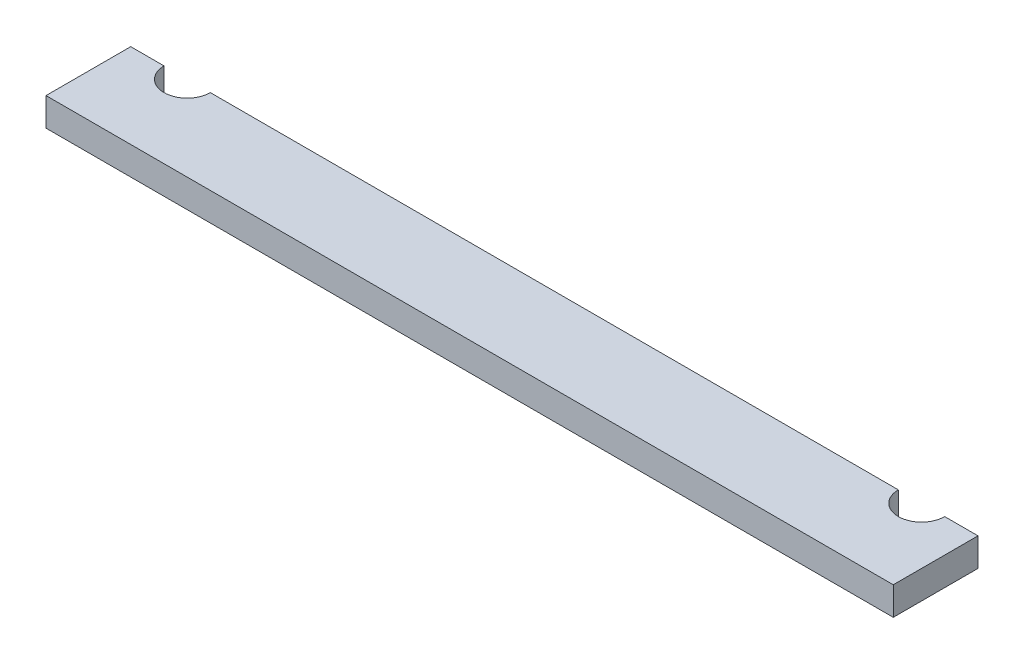
ISO-10303-21;
HEADER;
FILE_DESCRIPTION(('STEP AP214'),'2;1');
FILE_NAME('part.step','',(''),(''),'','','');
FILE_SCHEMA(('AUTOMOTIVE_DESIGN { 1 0 10303 214 1 1 1 1 }'));
ENDSEC;
DATA;
#1=APPLICATION_CONTEXT('core data for automotive mechanical design processes');
#2=APPLICATION_PROTOCOL_DEFINITION('international standard','automotive_design',2000,#1);
#3=PRODUCT_CONTEXT('',#1,'mechanical');
#4=PRODUCT('Part','Part','',(#3));
#5=PRODUCT_RELATED_PRODUCT_CATEGORY('part','',(#4));
#6=PRODUCT_DEFINITION_FORMATION('','',#4);
#7=PRODUCT_DEFINITION_CONTEXT('part definition',#1,'design');
#8=PRODUCT_DEFINITION('design','',#6,#7);
#9=PRODUCT_DEFINITION_SHAPE('','',#8);
#10=(LENGTH_UNIT() NAMED_UNIT(*) SI_UNIT(.MILLI.,.METRE.));
#11=(NAMED_UNIT(*) PLANE_ANGLE_UNIT() SI_UNIT($,.RADIAN.));
#12=(NAMED_UNIT(*) SI_UNIT($,.STERADIAN.) SOLID_ANGLE_UNIT());
#13=UNCERTAINTY_MEASURE_WITH_UNIT(LENGTH_MEASURE(1.E-05),#10,'distance_accuracy_value','');
#14=(GEOMETRIC_REPRESENTATION_CONTEXT(3) GLOBAL_UNCERTAINTY_ASSIGNED_CONTEXT((#13)) GLOBAL_UNIT_ASSIGNED_CONTEXT((#10,
#11,#12)) REPRESENTATION_CONTEXT('',''));
#15=CARTESIAN_POINT('',(0.,0.,0.));
#16=DIRECTION('',(0.,0.,1.));
#17=DIRECTION('',(1.,0.,0.));
#18=AXIS2_PLACEMENT_3D('',#15,#16,#17);
#19=CARTESIAN_POINT('',(0.,5.,15.));
#20=DIRECTION('',(0.,0.,-1.));
#21=DIRECTION('',(-1.,0.,0.));
#22=AXIS2_PLACEMENT_3D('',#19,#20,#21);
#23=PLANE('',#22);
#24=DIRECTION('',(1.,0.,0.));
#25=VECTOR('',#24,1.);
#26=CARTESIAN_POINT('',(0.,0.,15.));
#27=LINE('',#26,#25);
#28=CARTESIAN_POINT('',(0.,0.,15.));
#29=VERTEX_POINT('',#28);
#30=CARTESIAN_POINT('',(150.,0.,15.));
#31=VERTEX_POINT('',#30);
#32=EDGE_CURVE('E195',#29,#31,#27,.T.);
#33=ORIENTED_EDGE('',*,*,#32,.T.);
#34=DIRECTION('',(0.,-1.,0.));
#35=VECTOR('',#34,1.);
#36=CARTESIAN_POINT('',(150.,5.,15.));
#37=LINE('',#36,#35);
#38=CARTESIAN_POINT('',(150.,5.,15.));
#39=VERTEX_POINT('',#38);
#40=EDGE_CURVE('E11',#39,#31,#37,.T.);
#41=ORIENTED_EDGE('',*,*,#40,.F.);
#42=DIRECTION('',(1.,0.,0.));
#43=VECTOR('',#42,1.);
#44=CARTESIAN_POINT('',(0.,5.,15.));
#45=LINE('',#44,#43);
#46=CARTESIAN_POINT('',(0.,5.,15.));
#47=VERTEX_POINT('',#46);
#48=EDGE_CURVE('E100',#47,#39,#45,.T.);
#49=ORIENTED_EDGE('',*,*,#48,.F.);
#50=DIRECTION('',(0.,-1.,0.));
#51=VECTOR('',#50,1.);
#52=CARTESIAN_POINT('',(0.,5.,15.));
#53=LINE('',#52,#51);
#54=EDGE_CURVE('E141',#47,#29,#53,.T.);
#55=ORIENTED_EDGE('',*,*,#54,.T.);
#56=EDGE_LOOP('',(#33,#41,#49,#55));
#57=FACE_BOUND('',#56,.T.);
#58=ADVANCED_FACE('F47',(#57),#23,.F.);
#59=CARTESIAN_POINT('',(150.,5.,0.));
#60=DIRECTION('',(1.,0.,0.));
#61=DIRECTION('',(0.,0.,-1.));
#62=AXIS2_PLACEMENT_3D('',#59,#60,#61);
#63=PLANE('',#62);
#64=DIRECTION('',(0.,0.,1.));
#65=VECTOR('',#64,1.);
#66=CARTESIAN_POINT('',(150.,0.,0.));
#67=LINE('',#66,#65);
#68=CARTESIAN_POINT('',(150.,0.,0.));
#69=VERTEX_POINT('',#68);
#70=EDGE_CURVE('E189',#69,#31,#67,.T.);
#71=ORIENTED_EDGE('',*,*,#70,.F.);
#72=DIRECTION('',(0.,-1.,0.));
#73=VECTOR('',#72,1.);
#74=CARTESIAN_POINT('',(150.,5.,0.));
#75=LINE('',#74,#73);
#76=CARTESIAN_POINT('',(150.,5.,0.));
#77=VERTEX_POINT('',#76);
#78=EDGE_CURVE('E56',#77,#69,#75,.T.);
#79=ORIENTED_EDGE('',*,*,#78,.F.);
#80=DIRECTION('',(0.,0.,1.));
#81=VECTOR('',#80,1.);
#82=CARTESIAN_POINT('',(150.,5.,0.));
#83=LINE('',#82,#81);
#84=EDGE_CURVE('E154',#77,#39,#83,.T.);
#85=ORIENTED_EDGE('',*,*,#84,.T.);
#86=ORIENTED_EDGE('',*,*,#40,.T.);
#87=EDGE_LOOP('',(#71,#79,#85,#86));
#88=FACE_BOUND('',#87,.T.);
#89=ADVANCED_FACE('F190',(#88),#63,.T.);
#90=CARTESIAN_POINT('',(0.,5.,0.));
#91=DIRECTION('',(0.,0.,-1.));
#92=DIRECTION('',(-1.,0.,0.));
#93=AXIS2_PLACEMENT_3D('',#90,#91,#92);
#94=PLANE('',#93);
#95=DIRECTION('',(1.,0.,0.));
#96=VECTOR('',#95,1.);
#97=CARTESIAN_POINT('',(0.,0.,0.));
#98=LINE('',#97,#96);
#99=CARTESIAN_POINT('',(144.1,0.,0.));
#100=VERTEX_POINT('',#99);
#101=EDGE_CURVE('E186',#100,#69,#98,.T.);
#102=ORIENTED_EDGE('',*,*,#101,.F.);
#103=DIRECTION('',(0.,-1.,0.));
#104=VECTOR('',#103,1.);
#105=CARTESIAN_POINT('',(144.1,5.,0.));
#106=LINE('',#105,#104);
#107=CARTESIAN_POINT('',(144.1,5.,0.));
#108=VERTEX_POINT('',#107);
#109=EDGE_CURVE('E178',#108,#100,#106,.T.);
#110=ORIENTED_EDGE('',*,*,#109,.F.);
#111=DIRECTION('',(1.,0.,0.));
#112=VECTOR('',#111,1.);
#113=CARTESIAN_POINT('',(0.,5.,0.));
#114=LINE('',#113,#112);
#115=EDGE_CURVE('E148',#108,#77,#114,.T.);
#116=ORIENTED_EDGE('',*,*,#115,.T.);
#117=ORIENTED_EDGE('',*,*,#78,.T.);
#118=EDGE_LOOP('',(#102,#110,#116,#117));
#119=FACE_BOUND('',#118,.T.);
#120=ADVANCED_FACE('F184',(#119),#94,.T.);
#121=CARTESIAN_POINT('',(140.,5.,0.));
#122=DIRECTION('',(0.,-1.,0.));
#123=DIRECTION('',(0.,0.,-1.));
#124=AXIS2_PLACEMENT_3D('',#121,#122,#123);
#125=CYLINDRICAL_SURFACE('',#124,4.09999999999999);
#126=CARTESIAN_POINT('',(140.,0.,0.));
#127=DIRECTION('',(0.,1.,0.));
#128=DIRECTION('',(0.,0.,1.));
#129=AXIS2_PLACEMENT_3D('',#126,#127,#128);
#130=CIRCLE('',#129,4.09999999999999);
#131=CARTESIAN_POINT('',(135.9,0.,0.));
#132=VERTEX_POINT('',#131);
#133=EDGE_CURVE('E201',#100,#132,#130,.F.);
#134=ORIENTED_EDGE('',*,*,#133,.T.);
#135=DIRECTION('',(0.,-1.,0.));
#136=VECTOR('',#135,1.);
#137=CARTESIAN_POINT('',(135.9,5.,0.));
#138=LINE('',#137,#136);
#139=CARTESIAN_POINT('',(135.9,5.,0.));
#140=VERTEX_POINT('',#139);
#141=EDGE_CURVE('E175',#140,#132,#138,.T.);
#142=ORIENTED_EDGE('',*,*,#141,.F.);
#143=CARTESIAN_POINT('',(140.,5.,0.));
#144=DIRECTION('',(0.,1.,0.));
#145=DIRECTION('',(0.,0.,1.));
#146=AXIS2_PLACEMENT_3D('',#143,#144,#145);
#147=CIRCLE('',#146,4.09999999999999);
#148=EDGE_CURVE('E145',#108,#140,#147,.F.);
#149=ORIENTED_EDGE('',*,*,#148,.F.);
#150=ORIENTED_EDGE('',*,*,#109,.T.);
#151=EDGE_LOOP('',(#134,#142,#149,#150));
#152=FACE_BOUND('',#151,.T.);
#153=ADVANCED_FACE('F230',(#152),#125,.F.);
#154=CARTESIAN_POINT('',(0.,5.,0.));
#155=DIRECTION('',(0.,0.,-1.));
#156=DIRECTION('',(-1.,0.,0.));
#157=AXIS2_PLACEMENT_3D('',#154,#155,#156);
#158=PLANE('',#157);
#159=DIRECTION('',(1.,0.,0.));
#160=VECTOR('',#159,1.);
#161=CARTESIAN_POINT('',(0.,0.,0.));
#162=LINE('',#161,#160);
#163=CARTESIAN_POINT('',(14.1,0.,0.));
#164=VERTEX_POINT('',#163);
#165=EDGE_CURVE('E166',#164,#132,#162,.T.);
#166=ORIENTED_EDGE('',*,*,#165,.F.);
#167=DIRECTION('',(0.,-1.,0.));
#168=VECTOR('',#167,1.);
#169=CARTESIAN_POINT('',(14.1,5.,0.));
#170=LINE('',#169,#168);
#171=CARTESIAN_POINT('',(14.1,5.,0.));
#172=VERTEX_POINT('',#171);
#173=EDGE_CURVE('E128',#172,#164,#170,.T.);
#174=ORIENTED_EDGE('',*,*,#173,.F.);
#175=DIRECTION('',(1.,0.,0.));
#176=VECTOR('',#175,1.);
#177=CARTESIAN_POINT('',(0.,5.,0.));
#178=LINE('',#177,#176);
#179=EDGE_CURVE('E134',#172,#140,#178,.T.);
#180=ORIENTED_EDGE('',*,*,#179,.T.);
#181=ORIENTED_EDGE('',*,*,#141,.T.);
#182=EDGE_LOOP('',(#166,#174,#180,#181));
#183=FACE_BOUND('',#182,.T.);
#184=ADVANCED_FACE('F221',(#183),#158,.T.);
#185=CARTESIAN_POINT('',(9.99999999999999,5.,0.));
#186=DIRECTION('',(0.,-1.,0.));
#187=DIRECTION('',(0.,0.,-1.));
#188=AXIS2_PLACEMENT_3D('',#185,#186,#187);
#189=CYLINDRICAL_SURFACE('',#188,4.1);
#190=CARTESIAN_POINT('',(9.99999999999999,0.,0.));
#191=DIRECTION('',(0.,1.,0.));
#192=DIRECTION('',(0.,0.,1.));
#193=AXIS2_PLACEMENT_3D('',#190,#191,#192);
#194=CIRCLE('',#193,4.1);
#195=CARTESIAN_POINT('',(5.9,0.,0.));
#196=VERTEX_POINT('',#195);
#197=EDGE_CURVE('E122',#196,#164,#194,.T.);
#198=ORIENTED_EDGE('',*,*,#197,.F.);
#199=DIRECTION('',(0.,-1.,0.));
#200=VECTOR('',#199,1.);
#201=CARTESIAN_POINT('',(5.9,5.,0.));
#202=LINE('',#201,#200);
#203=CARTESIAN_POINT('',(5.9,5.,0.));
#204=VERTEX_POINT('',#203);
#205=EDGE_CURVE('E117',#204,#196,#202,.T.);
#206=ORIENTED_EDGE('',*,*,#205,.F.);
#207=CARTESIAN_POINT('',(9.99999999999999,5.,0.));
#208=DIRECTION('',(0.,1.,0.));
#209=DIRECTION('',(0.,0.,1.));
#210=AXIS2_PLACEMENT_3D('',#207,#208,#209);
#211=CIRCLE('',#210,4.1);
#212=EDGE_CURVE('E120',#204,#172,#211,.T.);
#213=ORIENTED_EDGE('',*,*,#212,.T.);
#214=ORIENTED_EDGE('',*,*,#173,.T.);
#215=EDGE_LOOP('',(#198,#206,#213,#214));
#216=FACE_BOUND('',#215,.T.);
#217=ADVANCED_FACE('F119',(#216),#189,.F.);
#218=CARTESIAN_POINT('',(0.,0.,0.));
#219=VERTEX_POINT('',#218);
#220=EDGE_CURVE('E162',#219,#196,#162,.T.);
#221=ORIENTED_EDGE('',*,*,#220,.F.);
#222=DIRECTION('',(0.,-1.,0.));
#223=VECTOR('',#222,1.);
#224=CARTESIAN_POINT('',(0.,5.,0.));
#225=LINE('',#224,#223);
#226=CARTESIAN_POINT('',(0.,5.,0.));
#227=VERTEX_POINT('',#226);
#228=EDGE_CURVE('E91',#227,#219,#225,.T.);
#229=ORIENTED_EDGE('',*,*,#228,.F.);
#230=EDGE_CURVE('E132',#227,#204,#178,.T.);
#231=ORIENTED_EDGE('',*,*,#230,.T.);
#232=ORIENTED_EDGE('',*,*,#205,.T.);
#233=EDGE_LOOP('',(#221,#229,#231,#232));
#234=FACE_BOUND('',#233,.T.);
#235=ADVANCED_FACE('F137',(#234),#158,.T.);
#236=CARTESIAN_POINT('',(0.,5.,0.));
#237=DIRECTION('',(1.,0.,0.));
#238=DIRECTION('',(0.,0.,-1.));
#239=AXIS2_PLACEMENT_3D('',#236,#237,#238);
#240=PLANE('',#239);
#241=DIRECTION('',(0.,0.,1.));
#242=VECTOR('',#241,1.);
#243=CARTESIAN_POINT('',(0.,0.,0.));
#244=LINE('',#243,#242);
#245=EDGE_CURVE('E94',#219,#29,#244,.T.);
#246=ORIENTED_EDGE('',*,*,#245,.T.);
#247=ORIENTED_EDGE('',*,*,#54,.F.);
#248=DIRECTION('',(0.,0.,1.));
#249=VECTOR('',#248,1.);
#250=CARTESIAN_POINT('',(0.,5.,0.));
#251=LINE('',#250,#249);
#252=EDGE_CURVE('E64',#227,#47,#251,.T.);
#253=ORIENTED_EDGE('',*,*,#252,.F.);
#254=ORIENTED_EDGE('',*,*,#228,.T.);
#255=EDGE_LOOP('',(#246,#247,#253,#254));
#256=FACE_BOUND('',#255,.T.);
#257=ADVANCED_FACE('F212',(#256),#240,.F.);
#258=CARTESIAN_POINT('',(0.,5.,0.));
#259=DIRECTION('',(0.,1.,0.));
#260=DIRECTION('',(0.,0.,1.));
#261=AXIS2_PLACEMENT_3D('',#258,#259,#260);
#262=PLANE('',#261);
#263=ORIENTED_EDGE('',*,*,#48,.T.);
#264=ORIENTED_EDGE('',*,*,#84,.F.);
#265=ORIENTED_EDGE('',*,*,#115,.F.);
#266=ORIENTED_EDGE('',*,*,#148,.T.);
#267=ORIENTED_EDGE('',*,*,#179,.F.);
#268=ORIENTED_EDGE('',*,*,#212,.F.);
#269=ORIENTED_EDGE('',*,*,#230,.F.);
#270=ORIENTED_EDGE('',*,*,#252,.T.);
#271=EDGE_LOOP('',(#263,#264,#265,#266,#267,#268,#269,#270));
#272=FACE_BOUND('',#271,.T.);
#273=ADVANCED_FACE('F131',(#272),#262,.T.);
#274=CARTESIAN_POINT('',(0.,0.,0.));
#275=DIRECTION('',(0.,1.,0.));
#276=DIRECTION('',(0.,0.,1.));
#277=AXIS2_PLACEMENT_3D('',#274,#275,#276);
#278=PLANE('',#277);
#279=ORIENTED_EDGE('',*,*,#32,.F.);
#280=ORIENTED_EDGE('',*,*,#245,.F.);
#281=ORIENTED_EDGE('',*,*,#220,.T.);
#282=ORIENTED_EDGE('',*,*,#197,.T.);
#283=ORIENTED_EDGE('',*,*,#165,.T.);
#284=ORIENTED_EDGE('',*,*,#133,.F.);
#285=ORIENTED_EDGE('',*,*,#101,.T.);
#286=ORIENTED_EDGE('',*,*,#70,.T.);
#287=EDGE_LOOP('',(#279,#280,#281,#282,#283,#284,#285,#286));
#288=FACE_BOUND('',#287,.T.);
#289=ADVANCED_FACE('F198',(#288),#278,.F.);
#290=CLOSED_SHELL('',(#58,#89,#120,#153,#184,#217,#235,#257,#273,#289));
#291=MANIFOLD_SOLID_BREP('B2',#290);
#292=ADVANCED_BREP_SHAPE_REPRESENTATION('',(#18,#291),#14);
#293=SHAPE_DEFINITION_REPRESENTATION(#9,#292);
ENDSEC;
END-ISO-10303-21;
